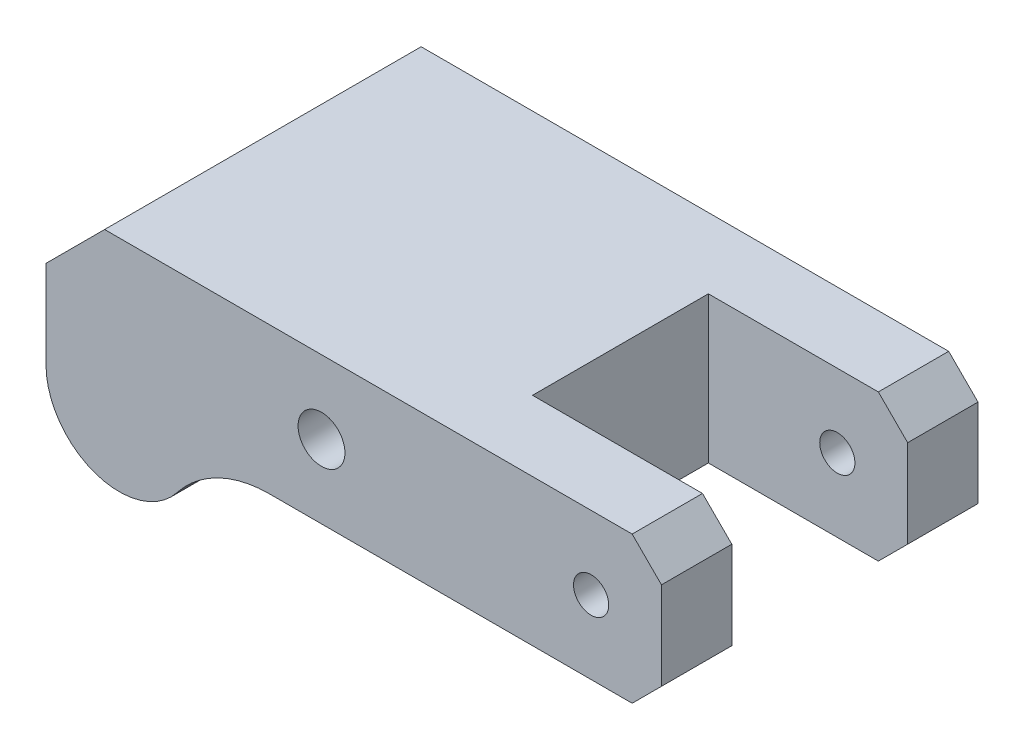
ISO-10303-21;
HEADER;
FILE_DESCRIPTION(('STEP AP214'),'2;1');
FILE_NAME('part.step','',(''),(''),'','','');
FILE_SCHEMA(('AUTOMOTIVE_DESIGN { 1 0 10303 214 1 1 1 1 }'));
ENDSEC;
DATA;
#1=APPLICATION_CONTEXT('core data for automotive mechanical design processes');
#2=APPLICATION_PROTOCOL_DEFINITION('international standard','automotive_design',2000,#1);
#3=PRODUCT_CONTEXT('',#1,'mechanical');
#4=PRODUCT('Part','Part','',(#3));
#5=PRODUCT_RELATED_PRODUCT_CATEGORY('part','',(#4));
#6=PRODUCT_DEFINITION_FORMATION('','',#4);
#7=PRODUCT_DEFINITION_CONTEXT('part definition',#1,'design');
#8=PRODUCT_DEFINITION('design','',#6,#7);
#9=PRODUCT_DEFINITION_SHAPE('','',#8);
#10=(LENGTH_UNIT() NAMED_UNIT(*) SI_UNIT(.MILLI.,.METRE.));
#11=(NAMED_UNIT(*) PLANE_ANGLE_UNIT() SI_UNIT($,.RADIAN.));
#12=(NAMED_UNIT(*) SI_UNIT($,.STERADIAN.) SOLID_ANGLE_UNIT());
#13=UNCERTAINTY_MEASURE_WITH_UNIT(LENGTH_MEASURE(1.E-05),#10,'distance_accuracy_value','');
#14=(GEOMETRIC_REPRESENTATION_CONTEXT(3) GLOBAL_UNCERTAINTY_ASSIGNED_CONTEXT((#13)) GLOBAL_UNIT_ASSIGNED_CONTEXT((#10,
#11,#12)) REPRESENTATION_CONTEXT('',''));
#15=CARTESIAN_POINT('',(0.,0.,0.));
#16=DIRECTION('',(0.,0.,1.));
#17=DIRECTION('',(1.,0.,0.));
#18=AXIS2_PLACEMENT_3D('',#15,#16,#17);
#19=CARTESIAN_POINT('',(33.4413115425505,25.,27.));
#20=DIRECTION('',(-1.,0.,0.));
#21=DIRECTION('',(0.,-1.,0.));
#22=AXIS2_PLACEMENT_3D('',#19,#20,#21);
#23=PLANE('',#22);
#24=DIRECTION('',(0.,0.,-1.));
#25=VECTOR('',#24,1.);
#26=CARTESIAN_POINT('',(33.4413115425505,4.99999999999999,27.));
#27=LINE('',#26,#25);
#28=CARTESIAN_POINT('',(33.4413115425505,4.99999999999999,27.));
#29=VERTEX_POINT('',#28);
#30=CARTESIAN_POINT('',(33.4413115425505,4.99999999999997,15.));
#31=VERTEX_POINT('',#30);
#32=EDGE_CURVE('E276',#29,#31,#27,.T.);
#33=ORIENTED_EDGE('',*,*,#32,.T.);
#34=DIRECTION('',(0.,1.,0.));
#35=VECTOR('',#34,1.);
#36=CARTESIAN_POINT('',(33.4413115425505,-12.5,15.));
#37=LINE('',#36,#35);
#38=CARTESIAN_POINT('',(33.4413115425505,20.,15.));
#39=VERTEX_POINT('',#38);
#40=EDGE_CURVE('E181',#31,#39,#37,.T.);
#41=ORIENTED_EDGE('',*,*,#40,.T.);
#42=DIRECTION('',(0.,0.,1.));
#43=VECTOR('',#42,1.);
#44=CARTESIAN_POINT('',(33.4413115425505,20.,27.));
#45=LINE('',#44,#43);
#46=CARTESIAN_POINT('',(33.4413115425505,20.,27.));
#47=VERTEX_POINT('',#46);
#48=EDGE_CURVE('E270',#39,#47,#45,.T.);
#49=ORIENTED_EDGE('',*,*,#48,.T.);
#50=DIRECTION('',(0.,1.,0.));
#51=VECTOR('',#50,1.);
#52=CARTESIAN_POINT('',(33.4413115425505,25.,27.));
#53=LINE('',#52,#51);
#54=EDGE_CURVE('E219',#29,#47,#53,.T.);
#55=ORIENTED_EDGE('',*,*,#54,.F.);
#56=EDGE_LOOP('',(#33,#41,#49,#55));
#57=FACE_BOUND('',#56,.T.);
#58=ADVANCED_FACE('F41',(#57),#23,.F.);
#59=CARTESIAN_POINT('',(33.4413115425505,4.99999999999999,27.));
#60=DIRECTION('',(-0.707106781186546,0.707106781186549,0.));
#61=DIRECTION('',(0.,0.,-1.));
#62=AXIS2_PLACEMENT_3D('',#59,#60,#61);
#63=PLANE('',#62);
#64=DIRECTION('',(0.707106781186549,0.707106781186546,0.));
#65=VECTOR('',#64,1.);
#66=CARTESIAN_POINT('',(33.4413115425505,4.99999999999999,15.));
#67=LINE('',#66,#65);
#68=CARTESIAN_POINT('',(28.4413115425505,0.,15.));
#69=VERTEX_POINT('',#68);
#70=EDGE_CURVE('E195',#31,#69,#67,.F.);
#71=ORIENTED_EDGE('',*,*,#70,.F.);
#72=ORIENTED_EDGE('',*,*,#32,.F.);
#73=DIRECTION('',(-0.707106781186549,-0.707106781186546,0.));
#74=VECTOR('',#73,1.);
#75=CARTESIAN_POINT('',(-15.3086884574496,-43.75,27.));
#76=LINE('',#75,#74);
#77=CARTESIAN_POINT('',(28.4413115425505,0.,27.));
#78=VERTEX_POINT('',#77);
#79=EDGE_CURVE('E293',#78,#29,#76,.F.);
#80=ORIENTED_EDGE('',*,*,#79,.F.);
#81=DIRECTION('',(0.,0.,1.));
#82=VECTOR('',#81,1.);
#83=CARTESIAN_POINT('',(28.4413115425505,0.,27.));
#84=LINE('',#83,#82);
#85=EDGE_CURVE('E286',#69,#78,#84,.T.);
#86=ORIENTED_EDGE('',*,*,#85,.F.);
#87=EDGE_LOOP('',(#71,#72,#80,#86));
#88=FACE_BOUND('',#87,.T.);
#89=ADVANCED_FACE('F346',(#88),#63,.F.);
#90=CARTESIAN_POINT('',(28.4413115425505,25.,27.));
#91=DIRECTION('',(-0.707106781186549,-0.707106781186547,0.));
#92=DIRECTION('',(0.,0.,-1.));
#93=AXIS2_PLACEMENT_3D('',#90,#91,#92);
#94=PLANE('',#93);
#95=DIRECTION('',(-0.707106781186547,0.707106781186549,0.));
#96=VECTOR('',#95,1.);
#97=CARTESIAN_POINT('',(28.4413115425505,25.,15.));
#98=LINE('',#97,#96);
#99=CARTESIAN_POINT('',(28.4413115425505,25.,15.));
#100=VERTEX_POINT('',#99);
#101=EDGE_CURVE('E11',#100,#39,#98,.F.);
#102=ORIENTED_EDGE('',*,*,#101,.F.);
#103=DIRECTION('',(0.,0.,-1.));
#104=VECTOR('',#103,1.);
#105=CARTESIAN_POINT('',(28.4413115425505,25.,27.));
#106=LINE('',#105,#104);
#107=CARTESIAN_POINT('',(28.4413115425505,25.,27.));
#108=VERTEX_POINT('',#107);
#109=EDGE_CURVE('E297',#108,#100,#106,.T.);
#110=ORIENTED_EDGE('',*,*,#109,.F.);
#111=DIRECTION('',(0.707106781186547,-0.707106781186549,0.));
#112=VECTOR('',#111,1.);
#113=CARTESIAN_POINT('',(-2.80868845744937,56.25,27.));
#114=LINE('',#113,#112);
#115=EDGE_CURVE('E67',#47,#108,#114,.F.);
#116=ORIENTED_EDGE('',*,*,#115,.F.);
#117=ORIENTED_EDGE('',*,*,#48,.F.);
#118=EDGE_LOOP('',(#102,#110,#116,#117));
#119=FACE_BOUND('',#118,.T.);
#120=ADVANCED_FACE('F314',(#119),#94,.F.);
#121=CARTESIAN_POINT('',(-71.5586884574495,25.,27.));
#122=DIRECTION('',(1.,0.,0.));
#123=DIRECTION('',(0.,0.,-1.));
#124=AXIS2_PLACEMENT_3D('',#121,#122,#123);
#125=PLANE('',#124);
#126=DIRECTION('',(0.,-1.,0.));
#127=VECTOR('',#126,1.);
#128=CARTESIAN_POINT('',(-71.5586884574495,25.,27.));
#129=LINE('',#128,#127);
#130=CARTESIAN_POINT('',(-71.5586884574495,15.,27.));
#131=VERTEX_POINT('',#130);
#132=CARTESIAN_POINT('',(-71.5586884574495,0.,27.));
#133=VERTEX_POINT('',#132);
#134=EDGE_CURVE('E205',#131,#133,#129,.T.);
#135=ORIENTED_EDGE('',*,*,#134,.F.);
#136=DIRECTION('',(0.,0.,-1.));
#137=VECTOR('',#136,1.);
#138=CARTESIAN_POINT('',(-71.5586884574495,15.,27.));
#139=LINE('',#138,#137);
#140=CARTESIAN_POINT('',(-71.5586884574495,15.,-27.));
#141=VERTEX_POINT('',#140);
#142=EDGE_CURVE('E255',#131,#141,#139,.T.);
#143=ORIENTED_EDGE('',*,*,#142,.T.);
#144=DIRECTION('',(0.,-1.,0.));
#145=VECTOR('',#144,1.);
#146=CARTESIAN_POINT('',(-71.5586884574495,25.,-27.));
#147=LINE('',#146,#145);
#148=CARTESIAN_POINT('',(-71.5586884574495,0.,-27.));
#149=VERTEX_POINT('',#148);
#150=EDGE_CURVE('E204',#141,#149,#147,.T.);
#151=ORIENTED_EDGE('',*,*,#150,.T.);
#152=DIRECTION('',(0.,0.,-1.));
#153=VECTOR('',#152,1.);
#154=CARTESIAN_POINT('',(-71.5586884574495,0.,27.));
#155=LINE('',#154,#153);
#156=EDGE_CURVE('E251',#133,#149,#155,.T.);
#157=ORIENTED_EDGE('',*,*,#156,.F.);
#158=EDGE_LOOP('',(#135,#143,#151,#157));
#159=FACE_BOUND('',#158,.T.);
#160=ADVANCED_FACE('F323',(#159),#125,.F.);
#161=CARTESIAN_POINT('',(-59.0586884574495,0.,27.));
#162=DIRECTION('',(0.,0.,-1.));
#163=DIRECTION('',(-1.,0.,0.));
#164=AXIS2_PLACEMENT_3D('',#161,#162,#163);
#165=CYLINDRICAL_SURFACE('',#164,12.5);
#166=CARTESIAN_POINT('',(-59.0586884574495,0.,-27.));
#167=DIRECTION('',(0.,0.,1.));
#168=DIRECTION('',(1.,0.,0.));
#169=AXIS2_PLACEMENT_3D('',#166,#167,#168);
#170=CIRCLE('',#169,12.5);
#171=CARTESIAN_POINT('',(-49.2058511824884,-7.69230769230769,-27.));
#172=VERTEX_POINT('',#171);
#173=EDGE_CURVE('E228',#149,#172,#170,.T.);
#174=ORIENTED_EDGE('',*,*,#173,.T.);
#175=DIRECTION('',(0.,0.,-1.));
#176=VECTOR('',#175,1.);
#177=CARTESIAN_POINT('',(-49.2058511824884,-7.69230769230769,27.));
#178=LINE('',#177,#176);
#179=CARTESIAN_POINT('',(-49.2058511824884,-7.69230769230769,27.));
#180=VERTEX_POINT('',#179);
#181=EDGE_CURVE('E247',#180,#172,#178,.T.);
#182=ORIENTED_EDGE('',*,*,#181,.F.);
#183=CARTESIAN_POINT('',(-59.0586884574495,0.,27.));
#184=DIRECTION('',(0.,0.,1.));
#185=DIRECTION('',(1.,0.,0.));
#186=AXIS2_PLACEMENT_3D('',#183,#184,#185);
#187=CIRCLE('',#186,12.5);
#188=EDGE_CURVE('E208',#133,#180,#187,.T.);
#189=ORIENTED_EDGE('',*,*,#188,.F.);
#190=ORIENTED_EDGE('',*,*,#156,.T.);
#191=EDGE_LOOP('',(#174,#182,#189,#190));
#192=FACE_BOUND('',#191,.T.);
#193=ADVANCED_FACE('F335',(#192),#165,.T.);
#194=CARTESIAN_POINT('',(-33.4413115425505,-20.,27.));
#195=DIRECTION('',(0.,0.,-1.));
#196=DIRECTION('',(-1.,0.,0.));
#197=AXIS2_PLACEMENT_3D('',#194,#195,#196);
#198=CYLINDRICAL_SURFACE('',#197,20.);
#199=CARTESIAN_POINT('',(-33.4413115425505,-20.,-27.));
#200=DIRECTION('',(0.,0.,-1.));
#201=DIRECTION('',(1.,0.,0.));
#202=AXIS2_PLACEMENT_3D('',#199,#200,#201);
#203=CIRCLE('',#202,20.);
#204=CARTESIAN_POINT('',(-33.4413115425505,0.,-27.));
#205=VERTEX_POINT('',#204);
#206=EDGE_CURVE('E231',#172,#205,#203,.T.);
#207=ORIENTED_EDGE('',*,*,#206,.T.);
#208=DIRECTION('',(0.,0.,-1.));
#209=VECTOR('',#208,1.);
#210=CARTESIAN_POINT('',(-33.4413115425505,0.,27.));
#211=LINE('',#210,#209);
#212=CARTESIAN_POINT('',(-33.4413115425505,0.,27.));
#213=VERTEX_POINT('',#212);
#214=EDGE_CURVE('E225',#213,#205,#211,.T.);
#215=ORIENTED_EDGE('',*,*,#214,.F.);
#216=CARTESIAN_POINT('',(-33.4413115425505,-20.,27.));
#217=DIRECTION('',(0.,0.,-1.));
#218=DIRECTION('',(1.,0.,0.));
#219=AXIS2_PLACEMENT_3D('',#216,#217,#218);
#220=CIRCLE('',#219,20.);
#221=EDGE_CURVE('E212',#180,#213,#220,.T.);
#222=ORIENTED_EDGE('',*,*,#221,.F.);
#223=ORIENTED_EDGE('',*,*,#181,.T.);
#224=EDGE_LOOP('',(#207,#215,#222,#223));
#225=FACE_BOUND('',#224,.T.);
#226=ADVANCED_FACE('F340',(#225),#198,.F.);
#227=CARTESIAN_POINT('',(33.4413115425505,0.,27.));
#228=DIRECTION('',(0.,1.,0.));
#229=DIRECTION('',(-1.,0.,0.));
#230=AXIS2_PLACEMENT_3D('',#227,#228,#229);
#231=PLANE('',#230);
#232=DIRECTION('',(0.,0.,1.));
#233=VECTOR('',#232,1.);
#234=CARTESIAN_POINT('',(-0.55868845744951,0.,27.));
#235=LINE('',#234,#233);
#236=CARTESIAN_POINT('',(-0.558688457449511,0.,-15.));
#237=VERTEX_POINT('',#236);
#238=CARTESIAN_POINT('',(-0.558688457449511,0.,15.));
#239=VERTEX_POINT('',#238);
#240=EDGE_CURVE('E159',#237,#239,#235,.T.);
#241=ORIENTED_EDGE('',*,*,#240,.T.);
#242=DIRECTION('',(1.,0.,0.));
#243=VECTOR('',#242,1.);
#244=CARTESIAN_POINT('',(33.4413115425505,0.,15.));
#245=LINE('',#244,#243);
#246=EDGE_CURVE('E198',#239,#69,#245,.T.);
#247=ORIENTED_EDGE('',*,*,#246,.T.);
#248=ORIENTED_EDGE('',*,*,#85,.T.);
#249=DIRECTION('',(1.,0.,0.));
#250=VECTOR('',#249,1.);
#251=CARTESIAN_POINT('',(33.4413115425505,0.,27.));
#252=LINE('',#251,#250);
#253=EDGE_CURVE('E215',#213,#78,#252,.T.);
#254=ORIENTED_EDGE('',*,*,#253,.F.);
#255=ORIENTED_EDGE('',*,*,#214,.T.);
#256=DIRECTION('',(1.,0.,0.));
#257=VECTOR('',#256,1.);
#258=CARTESIAN_POINT('',(33.4413115425505,0.,-27.));
#259=LINE('',#258,#257);
#260=CARTESIAN_POINT('',(28.4413115425505,0.,-27.));
#261=VERTEX_POINT('',#260);
#262=EDGE_CURVE('E234',#205,#261,#259,.T.);
#263=ORIENTED_EDGE('',*,*,#262,.T.);
#264=CARTESIAN_POINT('',(28.4413115425505,0.,-15.));
#265=VERTEX_POINT('',#264);
#266=EDGE_CURVE('E287',#261,#265,#84,.T.);
#267=ORIENTED_EDGE('',*,*,#266,.T.);
#268=DIRECTION('',(-1.,0.,0.));
#269=VECTOR('',#268,1.);
#270=CARTESIAN_POINT('',(33.4413115425505,0.,-15.));
#271=LINE('',#270,#269);
#272=EDGE_CURVE('E192',#265,#237,#271,.T.);
#273=ORIENTED_EDGE('',*,*,#272,.T.);
#274=EDGE_LOOP('',(#241,#247,#248,#254,#255,#263,#267,#273));
#275=FACE_BOUND('',#274,.T.);
#276=ADVANCED_FACE('F342',(#275),#231,.F.);
#277=CARTESIAN_POINT('',(33.4413115425505,20.,-27.));
#278=VERTEX_POINT('',#277);
#279=CARTESIAN_POINT('',(33.4413115425505,20.,-15.));
#280=VERTEX_POINT('',#279);
#281=EDGE_CURVE('E271',#278,#280,#45,.T.);
#282=ORIENTED_EDGE('',*,*,#281,.T.);
#283=DIRECTION('',(0.,1.,0.));
#284=VECTOR('',#283,1.);
#285=CARTESIAN_POINT('',(33.4413115425505,-12.5,-15.));
#286=LINE('',#285,#284);
#287=CARTESIAN_POINT('',(33.4413115425505,4.99999999999997,-15.));
#288=VERTEX_POINT('',#287);
#289=EDGE_CURVE('E59',#288,#280,#286,.T.);
#290=ORIENTED_EDGE('',*,*,#289,.F.);
#291=CARTESIAN_POINT('',(33.4413115425505,4.99999999999999,-27.));
#292=VERTEX_POINT('',#291);
#293=EDGE_CURVE('E275',#288,#292,#27,.T.);
#294=ORIENTED_EDGE('',*,*,#293,.T.);
#295=DIRECTION('',(0.,1.,0.));
#296=VECTOR('',#295,1.);
#297=CARTESIAN_POINT('',(33.4413115425505,25.,-27.));
#298=LINE('',#297,#296);
#299=EDGE_CURVE('E238',#292,#278,#298,.T.);
#300=ORIENTED_EDGE('',*,*,#299,.T.);
#301=EDGE_LOOP('',(#282,#290,#294,#300));
#302=FACE_BOUND('',#301,.T.);
#303=ADVANCED_FACE('F356',(#302),#23,.F.);
#304=CARTESIAN_POINT('',(-71.5586884574495,25.,27.));
#305=DIRECTION('',(0.,-1.,0.));
#306=DIRECTION('',(1.,0.,0.));
#307=AXIS2_PLACEMENT_3D('',#304,#305,#306);
#308=PLANE('',#307);
#309=ORIENTED_EDGE('',*,*,#109,.T.);
#310=DIRECTION('',(1.,0.,0.));
#311=VECTOR('',#310,1.);
#312=CARTESIAN_POINT('',(-0.558688457449507,25.,15.));
#313=LINE('',#312,#311);
#314=CARTESIAN_POINT('',(-0.558688457449507,25.,15.));
#315=VERTEX_POINT('',#314);
#316=EDGE_CURVE('E174',#315,#100,#313,.T.);
#317=ORIENTED_EDGE('',*,*,#316,.F.);
#318=DIRECTION('',(0.,0.,1.));
#319=VECTOR('',#318,1.);
#320=CARTESIAN_POINT('',(-0.558688457449507,25.,-15.));
#321=LINE('',#320,#319);
#322=CARTESIAN_POINT('',(-0.558688457449507,25.,-15.));
#323=VERTEX_POINT('',#322);
#324=EDGE_CURVE('E156',#323,#315,#321,.T.);
#325=ORIENTED_EDGE('',*,*,#324,.F.);
#326=DIRECTION('',(-1.,0.,0.));
#327=VECTOR('',#326,1.);
#328=CARTESIAN_POINT('',(33.4413115425505,25.,-15.));
#329=LINE('',#328,#327);
#330=CARTESIAN_POINT('',(28.4413115425505,25.,-15.));
#331=VERTEX_POINT('',#330);
#332=EDGE_CURVE('E165',#331,#323,#329,.T.);
#333=ORIENTED_EDGE('',*,*,#332,.F.);
#334=CARTESIAN_POINT('',(28.4413115425505,25.,-27.));
#335=VERTEX_POINT('',#334);
#336=EDGE_CURVE('E296',#331,#335,#106,.T.);
#337=ORIENTED_EDGE('',*,*,#336,.T.);
#338=DIRECTION('',(-1.,0.,0.));
#339=VECTOR('',#338,1.);
#340=CARTESIAN_POINT('',(-71.5586884574495,25.,-27.));
#341=LINE('',#340,#339);
#342=CARTESIAN_POINT('',(-61.5586884574495,25.,-27.));
#343=VERTEX_POINT('',#342);
#344=EDGE_CURVE('E209',#335,#343,#341,.T.);
#345=ORIENTED_EDGE('',*,*,#344,.T.);
#346=DIRECTION('',(0.,0.,1.));
#347=VECTOR('',#346,1.);
#348=CARTESIAN_POINT('',(-61.5586884574495,25.,27.));
#349=LINE('',#348,#347);
#350=CARTESIAN_POINT('',(-61.5586884574495,25.,27.));
#351=VERTEX_POINT('',#350);
#352=EDGE_CURVE('E263',#343,#351,#349,.T.);
#353=ORIENTED_EDGE('',*,*,#352,.T.);
#354=DIRECTION('',(-1.,0.,0.));
#355=VECTOR('',#354,1.);
#356=CARTESIAN_POINT('',(-71.5586884574495,25.,27.));
#357=LINE('',#356,#355);
#358=EDGE_CURVE('E222',#108,#351,#357,.T.);
#359=ORIENTED_EDGE('',*,*,#358,.F.);
#360=EDGE_LOOP('',(#309,#317,#325,#333,#337,#345,#353,#359));
#361=FACE_BOUND('',#360,.T.);
#362=ADVANCED_FACE('F173',(#361),#308,.F.);
#363=CARTESIAN_POINT('',(-59.0586884574495,0.,27.));
#364=DIRECTION('',(0.,0.,1.));
#365=DIRECTION('',(1.,0.,0.));
#366=AXIS2_PLACEMENT_3D('',#363,#364,#365);
#367=PLANE('',#366);
#368=CARTESIAN_POINT('',(21.4413115425505,12.5,27.));
#369=DIRECTION('',(0.,0.,1.));
#370=DIRECTION('',(1.,0.,0.));
#371=AXIS2_PLACEMENT_3D('',#368,#369,#370);
#372=CIRCLE('',#371,3.);
#373=CARTESIAN_POINT('',(24.4413115425505,12.5,27.));
#374=VERTEX_POINT('',#373);
#375=EDGE_CURVE('E431',#374,#374,#372,.T.);
#376=ORIENTED_EDGE('',*,*,#375,.F.);
#377=EDGE_LOOP('',(#376));
#378=FACE_BOUND('',#377,.T.);
#379=CARTESIAN_POINT('',(-24.5586884574495,12.5,27.));
#380=DIRECTION('',(0.,0.,1.));
#381=DIRECTION('',(1.,0.,0.));
#382=AXIS2_PLACEMENT_3D('',#379,#380,#381);
#383=CIRCLE('',#382,4.);
#384=CARTESIAN_POINT('',(-20.5586884574495,12.5,27.));
#385=VERTEX_POINT('',#384);
#386=EDGE_CURVE('E439',#385,#385,#383,.T.);
#387=ORIENTED_EDGE('',*,*,#386,.F.);
#388=EDGE_LOOP('',(#387));
#389=FACE_BOUND('',#388,.T.);
#390=ORIENTED_EDGE('',*,*,#253,.T.);
#391=ORIENTED_EDGE('',*,*,#79,.T.);
#392=ORIENTED_EDGE('',*,*,#54,.T.);
#393=ORIENTED_EDGE('',*,*,#115,.T.);
#394=ORIENTED_EDGE('',*,*,#358,.T.);
#395=DIRECTION('',(0.707106781186548,0.707106781186547,0.));
#396=VECTOR('',#395,1.);
#397=CARTESIAN_POINT('',(-72.8086884574495,13.75,27.));
#398=LINE('',#397,#396);
#399=EDGE_CURVE('E267',#351,#131,#398,.F.);
#400=ORIENTED_EDGE('',*,*,#399,.T.);
#401=ORIENTED_EDGE('',*,*,#134,.T.);
#402=ORIENTED_EDGE('',*,*,#188,.T.);
#403=ORIENTED_EDGE('',*,*,#221,.T.);
#404=EDGE_LOOP('',(#390,#391,#392,#393,#394,#400,#401,#402,#403));
#405=FACE_BOUND('',#404,.T.);
#406=ADVANCED_FACE('F311',(#378,#389,#405),#367,.T.);
#407=CARTESIAN_POINT('',(-59.0586884574495,0.,-27.));
#408=DIRECTION('',(0.,0.,1.));
#409=DIRECTION('',(1.,0.,0.));
#410=AXIS2_PLACEMENT_3D('',#407,#408,#409);
#411=PLANE('',#410);
#412=CARTESIAN_POINT('',(21.4413115425505,12.5,-27.));
#413=DIRECTION('',(0.,0.,1.));
#414=DIRECTION('',(1.,0.,0.));
#415=AXIS2_PLACEMENT_3D('',#412,#413,#414);
#416=CIRCLE('',#415,3.);
#417=CARTESIAN_POINT('',(24.4413115425505,12.5,-27.));
#418=VERTEX_POINT('',#417);
#419=EDGE_CURVE('E437',#418,#418,#416,.T.);
#420=ORIENTED_EDGE('',*,*,#419,.T.);
#421=EDGE_LOOP('',(#420));
#422=FACE_BOUND('',#421,.T.);
#423=CARTESIAN_POINT('',(-24.5586884574495,12.5,-27.));
#424=DIRECTION('',(0.,0.,1.));
#425=DIRECTION('',(1.,0.,0.));
#426=AXIS2_PLACEMENT_3D('',#423,#424,#425);
#427=CIRCLE('',#426,4.);
#428=CARTESIAN_POINT('',(-20.5586884574495,12.5,-27.));
#429=VERTEX_POINT('',#428);
#430=EDGE_CURVE('E443',#429,#429,#427,.T.);
#431=ORIENTED_EDGE('',*,*,#430,.T.);
#432=EDGE_LOOP('',(#431));
#433=FACE_BOUND('',#432,.T.);
#434=ORIENTED_EDGE('',*,*,#299,.F.);
#435=DIRECTION('',(0.707106781186549,0.707106781186546,0.));
#436=VECTOR('',#435,1.);
#437=CARTESIAN_POINT('',(33.4413115425505,4.99999999999999,-27.));
#438=LINE('',#437,#436);
#439=EDGE_CURVE('E283',#292,#261,#438,.F.);
#440=ORIENTED_EDGE('',*,*,#439,.T.);
#441=ORIENTED_EDGE('',*,*,#262,.F.);
#442=ORIENTED_EDGE('',*,*,#206,.F.);
#443=ORIENTED_EDGE('',*,*,#173,.F.);
#444=ORIENTED_EDGE('',*,*,#150,.F.);
#445=DIRECTION('',(-0.707106781186548,-0.707106781186547,0.));
#446=VECTOR('',#445,1.);
#447=CARTESIAN_POINT('',(-71.5586884574495,15.,-27.));
#448=LINE('',#447,#446);
#449=EDGE_CURVE('E259',#141,#343,#448,.F.);
#450=ORIENTED_EDGE('',*,*,#449,.T.);
#451=ORIENTED_EDGE('',*,*,#344,.F.);
#452=DIRECTION('',(-0.707106781186547,0.707106781186549,0.));
#453=VECTOR('',#452,1.);
#454=CARTESIAN_POINT('',(28.4413115425505,25.,-27.));
#455=LINE('',#454,#453);
#456=EDGE_CURVE('E280',#335,#278,#455,.F.);
#457=ORIENTED_EDGE('',*,*,#456,.T.);
#458=EDGE_LOOP('',(#434,#440,#441,#442,#443,#444,#450,#451,#457));
#459=FACE_BOUND('',#458,.T.);
#460=ADVANCED_FACE('F329',(#422,#433,#459),#411,.F.);
#461=CARTESIAN_POINT('',(-71.5586884574495,15.,27.));
#462=DIRECTION('',(0.707106781186547,-0.707106781186548,0.));
#463=DIRECTION('',(0.,0.,-1.));
#464=AXIS2_PLACEMENT_3D('',#461,#462,#463);
#465=PLANE('',#464);
#466=ORIENTED_EDGE('',*,*,#399,.F.);
#467=ORIENTED_EDGE('',*,*,#352,.F.);
#468=ORIENTED_EDGE('',*,*,#449,.F.);
#469=ORIENTED_EDGE('',*,*,#142,.F.);
#470=EDGE_LOOP('',(#466,#467,#468,#469));
#471=FACE_BOUND('',#470,.T.);
#472=ADVANCED_FACE('F325',(#471),#465,.F.);
#473=DIRECTION('',(-0.707106781186549,-0.707106781186546,0.));
#474=VECTOR('',#473,1.);
#475=CARTESIAN_POINT('',(33.4413115425505,4.99999999999999,-15.));
#476=LINE('',#475,#474);
#477=EDGE_CURVE('E185',#265,#288,#476,.F.);
#478=ORIENTED_EDGE('',*,*,#477,.F.);
#479=ORIENTED_EDGE('',*,*,#266,.F.);
#480=ORIENTED_EDGE('',*,*,#439,.F.);
#481=ORIENTED_EDGE('',*,*,#293,.F.);
#482=EDGE_LOOP('',(#478,#479,#480,#481));
#483=FACE_BOUND('',#482,.T.);
#484=ADVANCED_FACE('F353',(#483),#63,.F.);
#485=DIRECTION('',(0.707106781186547,-0.707106781186549,0.));
#486=VECTOR('',#485,1.);
#487=CARTESIAN_POINT('',(28.4413115425505,25.,-15.));
#488=LINE('',#487,#486);
#489=EDGE_CURVE('E52',#280,#331,#488,.F.);
#490=ORIENTED_EDGE('',*,*,#489,.F.);
#491=ORIENTED_EDGE('',*,*,#281,.F.);
#492=ORIENTED_EDGE('',*,*,#456,.F.);
#493=ORIENTED_EDGE('',*,*,#336,.F.);
#494=EDGE_LOOP('',(#490,#491,#492,#493));
#495=FACE_BOUND('',#494,.T.);
#496=ADVANCED_FACE('F44',(#495),#94,.F.);
#497=CARTESIAN_POINT('',(-0.558688457449512,-12.5,-15.));
#498=DIRECTION('',(-1.,0.,0.));
#499=DIRECTION('',(0.,-1.,0.));
#500=AXIS2_PLACEMENT_3D('',#497,#498,#499);
#501=PLANE('',#500);
#502=DIRECTION('',(0.,1.,0.));
#503=VECTOR('',#502,1.);
#504=CARTESIAN_POINT('',(-0.558688457449512,-12.5,-15.));
#505=LINE('',#504,#503);
#506=EDGE_CURVE('E151',#237,#323,#505,.T.);
#507=ORIENTED_EDGE('',*,*,#506,.T.);
#508=ORIENTED_EDGE('',*,*,#324,.T.);
#509=DIRECTION('',(0.,1.,0.));
#510=VECTOR('',#509,1.);
#511=CARTESIAN_POINT('',(-0.558688457449512,-12.5,15.));
#512=LINE('',#511,#510);
#513=EDGE_CURVE('E162',#239,#315,#512,.T.);
#514=ORIENTED_EDGE('',*,*,#513,.F.);
#515=ORIENTED_EDGE('',*,*,#240,.F.);
#516=EDGE_LOOP('',(#507,#508,#514,#515));
#517=FACE_BOUND('',#516,.T.);
#518=ADVANCED_FACE('F153',(#517),#501,.F.);
#519=CARTESIAN_POINT('',(-0.558688457449512,-12.5,15.));
#520=DIRECTION('',(0.,0.,1.));
#521=DIRECTION('',(1.,0.,0.));
#522=AXIS2_PLACEMENT_3D('',#519,#520,#521);
#523=PLANE('',#522);
#524=CARTESIAN_POINT('',(21.4413115425505,12.5,15.));
#525=DIRECTION('',(0.,0.,1.));
#526=DIRECTION('',(1.,0.,0.));
#527=AXIS2_PLACEMENT_3D('',#524,#525,#526);
#528=CIRCLE('',#527,3.);
#529=CARTESIAN_POINT('',(24.4413115425505,12.5,15.));
#530=VERTEX_POINT('',#529);
#531=EDGE_CURVE('E170',#530,#530,#528,.T.);
#532=ORIENTED_EDGE('',*,*,#531,.T.);
#533=EDGE_LOOP('',(#532));
#534=FACE_BOUND('',#533,.T.);
#535=ORIENTED_EDGE('',*,*,#513,.T.);
#536=ORIENTED_EDGE('',*,*,#316,.T.);
#537=ORIENTED_EDGE('',*,*,#101,.T.);
#538=ORIENTED_EDGE('',*,*,#40,.F.);
#539=ORIENTED_EDGE('',*,*,#70,.T.);
#540=ORIENTED_EDGE('',*,*,#246,.F.);
#541=EDGE_LOOP('',(#535,#536,#537,#538,#539,#540));
#542=FACE_BOUND('',#541,.T.);
#543=ADVANCED_FACE('F348',(#534,#542),#523,.F.);
#544=CARTESIAN_POINT('',(33.4413115425505,-12.5,-15.));
#545=DIRECTION('',(0.,0.,-1.));
#546=DIRECTION('',(-1.,0.,0.));
#547=AXIS2_PLACEMENT_3D('',#544,#545,#546);
#548=PLANE('',#547);
#549=CARTESIAN_POINT('',(21.4413115425505,12.5,-15.));
#550=DIRECTION('',(0.,0.,-1.));
#551=DIRECTION('',(-1.,0.,0.));
#552=AXIS2_PLACEMENT_3D('',#549,#550,#551);
#553=CIRCLE('',#552,3.);
#554=CARTESIAN_POINT('',(18.4413115425505,12.5,-15.));
#555=VERTEX_POINT('',#554);
#556=EDGE_CURVE('E46',#555,#555,#553,.T.);
#557=ORIENTED_EDGE('',*,*,#556,.T.);
#558=EDGE_LOOP('',(#557));
#559=FACE_BOUND('',#558,.T.);
#560=ORIENTED_EDGE('',*,*,#477,.T.);
#561=ORIENTED_EDGE('',*,*,#289,.T.);
#562=ORIENTED_EDGE('',*,*,#489,.T.);
#563=ORIENTED_EDGE('',*,*,#332,.T.);
#564=ORIENTED_EDGE('',*,*,#506,.F.);
#565=ORIENTED_EDGE('',*,*,#272,.F.);
#566=EDGE_LOOP('',(#560,#561,#562,#563,#564,#565));
#567=FACE_BOUND('',#566,.T.);
#568=ADVANCED_FACE('F166',(#559,#567),#548,.F.);
#569=CARTESIAN_POINT('',(21.4413115425505,12.5,-27.));
#570=DIRECTION('',(0.,0.,1.));
#571=DIRECTION('',(1.,0.,0.));
#572=AXIS2_PLACEMENT_3D('',#569,#570,#571);
#573=CYLINDRICAL_SURFACE('',#572,3.);
#574=ORIENTED_EDGE('',*,*,#419,.F.);
#575=EDGE_LOOP('',(#574));
#576=FACE_BOUND('',#575,.T.);
#577=ORIENTED_EDGE('',*,*,#556,.F.);
#578=EDGE_LOOP('',(#577));
#579=FACE_BOUND('',#578,.T.);
#580=ADVANCED_FACE('F411',(#576,#579),#573,.F.);
#581=ORIENTED_EDGE('',*,*,#375,.T.);
#582=EDGE_LOOP('',(#581));
#583=FACE_BOUND('',#582,.T.);
#584=ORIENTED_EDGE('',*,*,#531,.F.);
#585=EDGE_LOOP('',(#584));
#586=FACE_BOUND('',#585,.T.);
#587=ADVANCED_FACE('F420',(#583,#586),#573,.F.);
#588=CARTESIAN_POINT('',(-24.5586884574495,12.5,-27.));
#589=DIRECTION('',(0.,0.,1.));
#590=DIRECTION('',(1.,0.,0.));
#591=AXIS2_PLACEMENT_3D('',#588,#589,#590);
#592=CYLINDRICAL_SURFACE('',#591,4.);
#593=ORIENTED_EDGE('',*,*,#430,.F.);
#594=EDGE_LOOP('',(#593));
#595=FACE_BOUND('',#594,.T.);
#596=ORIENTED_EDGE('',*,*,#386,.T.);
#597=EDGE_LOOP('',(#596));
#598=FACE_BOUND('',#597,.T.);
#599=ADVANCED_FACE('F417',(#595,#598),#592,.F.);
#600=CLOSED_SHELL('',(#58,#89,#120,#160,#193,#226,#276,#303,#362,#406,#460,#472,#484,#496,#518,
#543,#568,#580,#587,#599));
#601=MANIFOLD_SOLID_BREP('B2',#600);
#602=ADVANCED_BREP_SHAPE_REPRESENTATION('',(#18,#601),#14);
#603=SHAPE_DEFINITION_REPRESENTATION(#9,#602);
ENDSEC;
END-ISO-10303-21;
